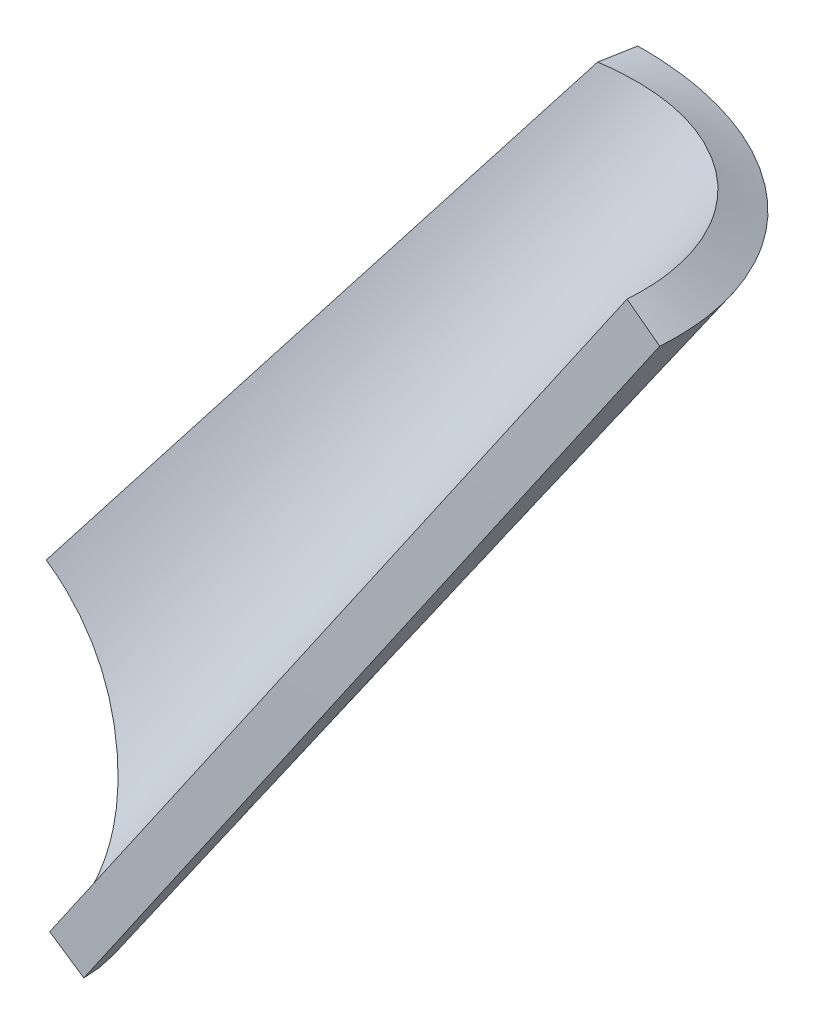
ISO-10303-21;
HEADER;
FILE_DESCRIPTION(('STEP AP214'),'2;1');
FILE_NAME('part.step','',(''),(''),'','','');
FILE_SCHEMA(('AUTOMOTIVE_DESIGN { 1 0 10303 214 1 1 1 1 }'));
ENDSEC;
DATA;
#1=APPLICATION_CONTEXT('core data for automotive mechanical design processes');
#2=APPLICATION_PROTOCOL_DEFINITION('international standard','automotive_design',2000,#1);
#3=PRODUCT_CONTEXT('',#1,'mechanical');
#4=PRODUCT('Part','Part','',(#3));
#5=PRODUCT_RELATED_PRODUCT_CATEGORY('part','',(#4));
#6=PRODUCT_DEFINITION_FORMATION('','',#4);
#7=PRODUCT_DEFINITION_CONTEXT('part definition',#1,'design');
#8=PRODUCT_DEFINITION('design','',#6,#7);
#9=PRODUCT_DEFINITION_SHAPE('','',#8);
#10=(LENGTH_UNIT() NAMED_UNIT(*) SI_UNIT(.MILLI.,.METRE.));
#11=(NAMED_UNIT(*) PLANE_ANGLE_UNIT() SI_UNIT($,.RADIAN.));
#12=(NAMED_UNIT(*) SI_UNIT($,.STERADIAN.) SOLID_ANGLE_UNIT());
#13=UNCERTAINTY_MEASURE_WITH_UNIT(LENGTH_MEASURE(1.E-05),#10,'distance_accuracy_value','');
#14=(GEOMETRIC_REPRESENTATION_CONTEXT(3) GLOBAL_UNCERTAINTY_ASSIGNED_CONTEXT((#13)) GLOBAL_UNIT_ASSIGNED_CONTEXT((#10,
#11,#12)) REPRESENTATION_CONTEXT('',''));
#15=CARTESIAN_POINT('',(0.,0.,0.));
#16=DIRECTION('',(0.,0.,1.));
#17=DIRECTION('',(1.,0.,0.));
#18=AXIS2_PLACEMENT_3D('',#15,#16,#17);
#19=CARTESIAN_POINT('',(19.19780043,40.35560943567,-81.05915159983));
#20=CARTESIAN_POINT('',(15.36714821498,35.196785567,-80.16578797194));
#21=CARTESIAN_POINT('',(11.53463373893,30.03911414575,-79.27382849018));
#22=CARTESIAN_POINT('',(7.700473535317,24.88252279043,-78.38275118747));
#23=CARTESIAN_POINT('',(19.98427932232,40.39850845703,-81.08396009177));
#24=CARTESIAN_POINT('',(16.09145871903,35.08884611076,-80.18347263879));
#25=CARTESIAN_POINT('',(12.19572092038,29.78077982506,-79.28637391232));
#26=CARTESIAN_POINT('',(8.297170356674,24.47442152651,-78.39161751106));
#27=CARTESIAN_POINT('',(21.54532023451,40.47360416492,-80.83326713255));
#28=CARTESIAN_POINT('',(17.53865433005,34.83112028675,-79.93026298569));
#29=CARTESIAN_POINT('',(13.52541873388,29.19050420122,-79.04493479016));
#30=CARTESIAN_POINT('',(9.502772346953,23.55528203759,-78.16746533124));
#31=CARTESIAN_POINT('',(23.55391764842,40.56213321461,-79.567571651));
#32=CARTESIAN_POINT('',(19.36452959766,34.41751848333,-78.71430295676));
#33=CARTESIAN_POINT('',(15.19012914971,28.26270621502,-77.86113210588));
#34=CARTESIAN_POINT('',(11.02204616266,22.1014931435,-77.02473779771));
#35=CARTESIAN_POINT('',(24.91187042956,40.67557922437,-77.60702178161));
#36=CARTESIAN_POINT('',(20.51069286324,34.1947421457,-76.97028198699));
#37=CARTESIAN_POINT('',(16.11295273754,27.71309229054,-76.31726952713));
#38=CARTESIAN_POINT('',(11.7423090518,21.21621165036,-75.63372780884));
#39=CARTESIAN_POINT('',(25.22196463558,40.77395234289,-76.02701783253));
#40=CARTESIAN_POINT('',(20.76364686307,34.19385485233,-75.61910614983));
#41=CARTESIAN_POINT('',(16.30532785949,27.61396059646,-75.20673615172));
#42=CARTESIAN_POINT('',(11.84891001115,21.03374213824,-74.77457848874));
#43=CARTESIAN_POINT('',(25.20849150693,40.82650594131,-75.22750245546));
#44=CARTESIAN_POINT('',(20.75210415669,34.22890895003,-74.93556536451));
#45=CARTESIAN_POINT('',(16.29567679635,27.63141405475,-74.64191497476));
#46=CARTESIAN_POINT('',(11.83951640869,21.03405157658,-74.34104070701));
#47=B_SPLINE_SURFACE_WITH_KNOTS('',3,3,((#19,#20,#21,#22),(#23,#24,#25,#26),(#27,#28,#29,#30),
(#31,#32,#33,#34),(#35,#36,#37,#38),(#39,#40,#41,#42),(#43,#44,#45,#46)),.UNSPECIFIED.,.F.,.F.,
.F.,(4,1,1,1,4),(4,4),(-0.009239570919422,0.2499997679812,0.4999994776936,0.749999187406,
1.009963971349),(-0.009999684538522,1.009999615068),.UNSPECIFIED.);
#48=CARTESIAN_POINT('',(25.0782141319622,40.6264914464682,-75.3104917971679));
#49=CARTESIAN_POINT('',(24.6800187386289,40.0371751706416,-75.2832108346427));
#50=CARTESIAN_POINT('',(24.281823170709,39.4478597825788,-75.2559131057691));
#51=CARTESIAN_POINT('',(22.2908463579273,36.50128707307,-75.1193170582146));
#52=CARTESIAN_POINT('',(20.6980682501908,34.1440425279119,-75.0096965338548));
#53=CARTESIAN_POINT('',(18.3089429496475,30.6081927006993,-74.8442976716293));
#54=CARTESIAN_POINT('',(17.5125748281861,29.4295789261592,-74.7890033717379));
#55=CARTESIAN_POINT('',(15.9253850293488,27.0805354632197,-74.6784017531694));
#56=CARTESIAN_POINT('',(15.1345632127703,25.9101057393345,-74.6230971876131));
#57=CARTESIAN_POINT('',(13.5529454485636,23.5692507758125,-74.5120215838698));
#58=CARTESIAN_POINT('',(12.7621495009379,22.3988255361761,-74.4562505456344));
#59=CARTESIAN_POINT('',(11.9713695786178,21.2284023716688,-74.400209344384));
#60=B_SPLINE_CURVE_WITH_KNOTS('',3,(#48,#49,#50,#51,#52,#53,#54,#55,#56,#57,#58,#59),
.UNSPECIFIED.,.F.,.F.,(4,2,2,2,2,4),(0.,2.13526989135754,10.6763495580857,14.9468893713277,
19.1877938378051,23.4286987430444),.UNSPECIFIED.);
#61=CARTESIAN_POINT('',(25.0782141423339,40.626491461818,-75.3104917978784));
#62=VERTEX_POINT('',#61);
#63=CARTESIAN_POINT('',(11.9713695846468,21.2284023806685,-74.4002091368315));
#64=VERTEX_POINT('',#63);
#65=EDGE_CURVE('E60',#62,#64,#60,.T.);
#66=CARTESIAN_POINT('',(18.7381080046836,39.6273094041304,-80.9346082763461));
#67=CARTESIAN_POINT('',(18.9223542234289,39.6474171703624,-80.9401558983225));
#68=CARTESIAN_POINT('',(19.106810597893,39.667686404681,-80.9383074153619));
#69=CARTESIAN_POINT('',(19.4750291798496,39.7085708415526,-80.919808656822));
#70=CARTESIAN_POINT('',(19.6587910159293,39.729186203892,-80.9031513496952));
#71=CARTESIAN_POINT('',(20.0248102287611,39.7708216241755,-80.8549566711681));
#72=CARTESIAN_POINT('',(20.2070623662183,39.7918426052531,-80.82338021157));
#73=CARTESIAN_POINT('',(20.5682783872567,39.8342965937615,-80.745297275747));
#74=CARTESIAN_POINT('',(20.7472427339062,39.8557295422852,-80.6987929193491));
#75=CARTESIAN_POINT('',(21.1009750340508,39.8985608769585,-80.5903233025079));
#76=CARTESIAN_POINT('',(21.2757305934614,39.9199590205191,-80.5283173473774));
#77=CARTESIAN_POINT('',(21.6190892490573,39.9621734699416,-80.3889581400054));
#78=CARTESIAN_POINT('',(21.7876924667987,39.9829897872971,-80.3116051911796));
#79=CARTESIAN_POINT('',(22.1171202374812,40.0242819805682,-80.1422526949256));
#80=CARTESIAN_POINT('',(22.2779548231166,40.0447582718777,-80.050272734545));
#81=CARTESIAN_POINT('',(22.5908463611605,40.0863554012508,-79.8524555724455));
#82=CARTESIAN_POINT('',(22.7429017076231,40.1074763561663,-79.746615846923));
#83=CARTESIAN_POINT('',(22.9837615678866,40.1427679439171,-79.5622557227502));
#84=CARTESIAN_POINT('',(23.075611591035,40.1567001284279,-79.4876366619093));
#85=CARTESIAN_POINT('',(23.2546416572791,40.1847404985631,-79.3330390329096));
#86=CARTESIAN_POINT('',(23.3418226571169,40.198848647394,-79.2530615703746));
#87=CARTESIAN_POINT('',(23.5110140195986,40.226721253499,-79.0877911552924));
#88=CARTESIAN_POINT('',(23.5930256875527,40.2404857970027,-79.0024995555245));
#89=CARTESIAN_POINT('',(23.7513904903141,40.2672326180138,-78.8266487585991));
#90=CARTESIAN_POINT('',(23.8277420722414,40.2802146806614,-78.7360881279243));
#91=CARTESIAN_POINT('',(23.9743304597319,40.3052932180398,-78.5500015860235));
#92=CARTESIAN_POINT('',(24.0445661800552,40.3173895355376,-78.4544747983523));
#93=CARTESIAN_POINT('',(24.1786486297008,40.3409844332299,-78.2589829894365));
#94=CARTESIAN_POINT('',(24.2424954570985,40.3524830225987,-78.1590180363559));
#95=CARTESIAN_POINT('',(24.3842013345038,40.3793450893748,-77.920943375623));
#96=CARTESIAN_POINT('',(24.4595376426039,40.3947059752211,-77.7813256028293));
#97=CARTESIAN_POINT('',(24.5983525019161,40.4260643145763,-77.4963565302871));
#98=CARTESIAN_POINT('',(24.661830111188,40.4420618185297,-77.3510047761964));
#99=CARTESIAN_POINT('',(24.7476627432603,40.4661834717212,-77.1294989085915));
#100=CARTESIAN_POINT('',(24.7746984140783,40.4742408382741,-77.0551221952413));
#101=CARTESIAN_POINT('',(24.8255500513493,40.4902536627897,-76.9052574408032));
#102=CARTESIAN_POINT('',(24.8493659996662,40.4982091201781,-76.8297693934582));
#103=CARTESIAN_POINT('',(24.8935625121015,40.513760413001,-76.677801885137));
#104=CARTESIAN_POINT('',(24.9139449581568,40.5213564437881,-76.6013229921727));
#105=CARTESIAN_POINT('',(24.9511683001084,40.5360763942494,-76.4474707360835));
#106=CARTESIAN_POINT('',(24.9680095477754,40.5432003607688,-76.3700974626098));
#107=CARTESIAN_POINT('',(24.9987096348412,40.5572608539199,-76.2115478668985));
#108=CARTESIAN_POINT('',(25.0124244821511,40.5641788770908,-76.1303419979385));
#109=CARTESIAN_POINT('',(25.035967663063,40.5775575060188,-75.9673403839675));
#110=CARTESIAN_POINT('',(25.0457963867318,40.5840181576309,-75.8855446989985));
#111=CARTESIAN_POINT('',(25.0615834321387,40.59657485729,-75.7216490058982));
#112=CARTESIAN_POINT('',(25.0675461335231,40.6026713107849,-75.6395494484687));
#113=CARTESIAN_POINT('',(25.075695037663,40.6146785336032,-75.4751318461972));
#114=CARTESIAN_POINT('',(25.0778804637681,40.6205892644948,-75.3928137599071));
#115=CARTESIAN_POINT('',(25.0782141400809,40.6264914228395,-75.3104923404911));
#116=B_SPLINE_CURVE_WITH_KNOTS('',3,(#66,#67,#68,#69,#70,#71,#72,#73,#74,#75,#76,#77,#78,#79,
#80,#81,#82,#83,#84,#85,#86,#87,#88,#89,#90,#91,#92,#93,#94,#95,#96,#97,#98,#99,#100,#101,#102,
#103,#104,#105,#106,#107,#108,#109,#110,#111,#112,#113,#114,#115),.UNSPECIFIED.,.F.,.F.,(4,2,2,
2,2,2,2,2,2,2,2,2,2,2,2,2,2,2,2,2,2,2,2,2,4),(0.,0.556131107097961,1.1125264182948,
1.67038763869626,2.22816967536955,2.78743166269778,3.34668259431151,3.90519084271224,
4.46380093485633,4.82108913601933,5.17830384194444,5.53542798306691,5.89264974357406,
6.24993476330356,6.60721429753747,7.08482116919518,7.56246596120202,7.80104847976377,
8.03963234215928,8.27808500582435,8.51651397120761,8.76435592725861,9.01217300003602,
9.25970883895971,9.50729556799756),.UNSPECIFIED.);
#117=CARTESIAN_POINT('',(18.738123586735,39.6271726135356,-80.9345860406653));
#118=VERTEX_POINT('',#117);
#119=EDGE_CURVE('E68',#118,#62,#116,.T.);
#120=CARTESIAN_POINT('',(18.7382894792975,39.6270526252046,-80.9345685017668));
#121=CARTESIAN_POINT('',(18.3182473785016,39.0606168881886,-80.8367184609739));
#122=CARTESIAN_POINT('',(17.8981815966424,38.4941953862846,-80.7388876681943));
#123=CARTESIAN_POINT('',(15.7977355888738,35.6621587186584,-80.2498260540936));
#124=CARTESIAN_POINT('',(14.1170041442743,33.3967561820912,-79.8588723000408));
#125=CARTESIAN_POINT('',(10.9166658296751,29.0844676346334,-79.1150701832488));
#126=CARTESIAN_POINT('',(9.39712449428158,27.0375407583459,-78.7621767683693));
#127=CARTESIAN_POINT('',(7.87730370356891,24.9907931651012,-78.4094474228258));
#128=B_SPLINE_CURVE_WITH_KNOTS('',3,(#120,#121,#122,#123,#124,#125,#126,#127),.UNSPECIFIED.,.F.,
.F.,(4,2,2,4),(0.,2.13582184978764,10.6791093789882,18.3999280576752),.UNSPECIFIED.);
#129=CARTESIAN_POINT('',(7.87707592739809,24.9909331640915,-78.4096164939905));
#130=VERTEX_POINT('',#129);
#131=EDGE_CURVE('E129',#118,#130,#128,.T.);
#132=CARTESIAN_POINT('',(11.9713695906757,21.2284023896681,-74.4002089292789));
#133=CARTESIAN_POINT('',(11.9721113244206,21.2294054281782,-74.4707531005988));
#134=CARTESIAN_POINT('',(11.9710751650357,21.2328776734502,-74.5412767034068));
#135=CARTESIAN_POINT('',(11.96540254008,21.2445990031911,-74.6817173031448));
#136=CARTESIAN_POINT('',(11.9607692860076,21.2528438250179,-74.7516347849476));
#137=CARTESIAN_POINT('',(11.9479175018375,21.2738561533096,-74.8898010721066));
#138=CARTESIAN_POINT('',(11.939731596329,21.2865823109407,-74.9580592301995));
#139=CARTESIAN_POINT('',(11.9198994068338,21.316224559136,-75.0931517821999));
#140=CARTESIAN_POINT('',(11.9082523144492,21.3331416283797,-75.1599858395804));
#141=CARTESIAN_POINT('',(11.877377478121,21.3768143975801,-75.3132890094175));
#142=CARTESIAN_POINT('',(11.8569162780876,21.4049822296438,-75.3991102919041));
#143=CARTESIAN_POINT('',(11.8108604391054,21.4667584239535,-75.5673273750255));
#144=CARTESIAN_POINT('',(11.7852635322466,21.50036918851,-75.6497216428273));
#145=CARTESIAN_POINT('',(11.701434875546,21.6080529972218,-75.8922169640233));
#146=CARTESIAN_POINT('',(11.6362880172432,21.6888005991664,-76.0470558298476));
#147=CARTESIAN_POINT('',(11.5125853844373,21.8358014919121,-76.2960013459032));
#148=CARTESIAN_POINT('',(11.4581497931849,21.8988903540777,-76.3941556565606));
#149=CARTESIAN_POINT('',(11.3423041805419,22.0297028550939,-76.583039793868));
#150=CARTESIAN_POINT('',(11.2808925594439,22.0974275555905,-76.6737679093409));
#151=CARTESIAN_POINT('',(11.1517168801826,22.2364885038001,-76.8478085111692));
#152=CARTESIAN_POINT('',(11.0839453742121,22.3078289396569,-76.931112074727));
#153=CARTESIAN_POINT('',(10.9427795620367,22.4531454332105,-77.0903145828997));
#154=CARTESIAN_POINT('',(10.8693842425356,22.5271219645871,-77.1662121874851));
#155=CARTESIAN_POINT('',(10.684760360887,22.7097362397768,-77.3432213231785));
#156=CARTESIAN_POINT('',(10.5710693005538,22.8193317445461,-77.4407724080506));
#157=CARTESIAN_POINT('',(10.3357524180354,23.0407906908017,-77.6229954520362));
#158=CARTESIAN_POINT('',(10.2141230649257,23.152655126042,-77.7076616234284));
#159=CARTESIAN_POINT('',(10.0261983704079,23.3211753188948,-77.8247384448486));
#160=CARTESIAN_POINT('',(9.96263552523736,23.377476003179,-77.8621141433362));
#161=CARTESIAN_POINT('',(9.83370728415754,23.4901977864759,-77.9334327897149));
#162=CARTESIAN_POINT('',(9.76834190313128,23.5466188844908,-77.9673757659382));
#163=CARTESIAN_POINT('',(9.63589315455643,23.6594594338743,-78.0316010029658));
#164=CARTESIAN_POINT('',(9.56881061044956,23.7158788735087,-78.0618849799667));
#165=CARTESIAN_POINT('',(9.43297926277047,23.8286022839347,-78.1186747921955));
#166=CARTESIAN_POINT('',(9.36423051679601,23.8849062586449,-78.1451807578054));
#167=CARTESIAN_POINT('',(9.18297838383993,24.0312728818292,-78.2093736043477));
#168=CARTESIAN_POINT('',(9.06922186840676,24.1211032213965,-78.2440941471988));
#169=CARTESIAN_POINT('',(8.8383094422847,24.2996163926825,-78.3038077841172));
#170=CARTESIAN_POINT('',(8.72115325201076,24.3882991291516,-78.3288000756952));
#171=CARTESIAN_POINT('',(8.48417539214814,24.5639566500661,-78.3689423428071));
#172=CARTESIAN_POINT('',(8.36435793865981,24.650933775019,-78.3841068774712));
#173=CARTESIAN_POINT('',(8.12237545365414,24.8227167278798,-78.4043825098799));
#174=CARTESIAN_POINT('',(8.00021083999007,24.9075229361089,-78.4094953806299));
#175=CARTESIAN_POINT('',(7.87709415525928,24.9909599163604,-78.4094501336042));
#176=B_SPLINE_CURVE_WITH_KNOTS('',3,(#132,#133,#134,#135,#136,#137,#138,#139,#140,#141,#142,
#143,#144,#145,#146,#147,#148,#149,#150,#151,#152,#153,#154,#155,#156,#157,#158,#159,#160,#161,
#162,#163,#164,#165,#166,#167,#168,#169,#170,#171,#172,#173,#174,#175),.UNSPECIFIED.,.F.,.F.,(4,
2,2,2,2,2,2,2,2,2,2,2,2,2,2,2,2,2,2,2,2,4),(0.,0.211595329538772,0.423001962987934,
0.63250698486485,0.842060977438049,1.11945390846524,1.39696960591068,1.95382119957205,
2.33965903427583,2.72558552662861,3.11196974012975,3.49842373661253,4.05455247129688,
4.61093027848955,4.88918496087899,5.16743734648346,5.44555871127829,5.72367047556495,
6.17042451790721,6.61721540545856,7.06334288151805,7.50939165842329),.UNSPECIFIED.);
#177=EDGE_CURVE('E77',#64,#130,#176,.T.);
#178=ORIENTED_EDGE('',*,*,#65,.F.);
#179=ORIENTED_EDGE('',*,*,#119,.F.);
#180=ORIENTED_EDGE('',*,*,#131,.T.);
#181=ORIENTED_EDGE('',*,*,#177,.F.);
#182=EDGE_LOOP('',(#178,#179,#180,#181));
#183=FACE_BOUND('',#182,.T.);
#184=ADVANCED_FACE('F16',(#183),#47,.F.);
#185=CARTESIAN_POINT('',(25.94092029263,40.04781234963,-75.24660664052));
#186=CARTESIAN_POINT('',(25.64248314414,40.24900997379,-75.2604920733));
#187=CARTESIAN_POINT('',(25.34404599564,40.45020759795,-75.27437750608));
#188=CARTESIAN_POINT('',(25.04560884714,40.65140522211,-75.28826293886));
#189=CARTESIAN_POINT('',(25.94035007971,40.0480048837,-75.25334606068));
#190=CARTESIAN_POINT('',(25.6419757189,40.24906417069,-75.26710891896));
#191=CARTESIAN_POINT('',(25.34360135809,40.45012345768,-75.28087177725));
#192=CARTESIAN_POINT('',(25.04522699728,40.65118274468,-75.29463463553));
#193=CARTESIAN_POINT('',(25.94048365738,40.04628754776,-75.26320621873));
#194=CARTESIAN_POINT('',(25.64202190371,40.24732082345,-75.27683516428));
#195=CARTESIAN_POINT('',(25.34356015005,40.44835409916,-75.29046410973));
#196=CARTESIAN_POINT('',(25.04509839639,40.64938737484,-75.30409305526));
#197=CARTESIAN_POINT('',(25.93900380611,40.01064065103,-75.77263919003));
#198=CARTESIAN_POINT('',(25.64042168016,40.21305135032,-75.76256713581));
#199=CARTESIAN_POINT('',(25.34183955354,40.41546204894,-75.75249508694));
#200=CARTESIAN_POINT('',(25.04325742759,40.61787274889,-75.74242303406));
#201=CARTESIAN_POINT('',(25.83438065699,39.93455930169,-76.82292733352));
#202=CARTESIAN_POINT('',(25.53913305679,40.13838738605,-76.76482916549));
#203=CARTESIAN_POINT('',(25.24388545691,40.34221547072,-76.70673099497));
#204=CARTESIAN_POINT('',(24.94863785671,40.54604355477,-76.64863282632));
#205=CARTESIAN_POINT('',(25.0706132398,39.78111780156,-78.62433790298));
#206=CARTESIAN_POINT('',(24.80208726483,39.97883682262,-78.47974697417));
#207=CARTESIAN_POINT('',(24.53356128978,40.1765558436,-78.33515604603));
#208=CARTESIAN_POINT('',(24.26503531482,40.37427486474,-78.19056511739));
#209=CARTESIAN_POINT('',(24.05839777559,39.66702155703,-79.91005506095));
#210=CARTESIAN_POINT('',(23.82833181227,39.85210771572,-79.69805651729));
#211=CARTESIAN_POINT('',(23.59826584897,40.03719387442,-79.48605797346));
#212=CARTESIAN_POINT('',(23.36819988564,40.22228003308,-79.27405942975));
#213=CARTESIAN_POINT('',(22.46655221821,39.5435614939,-81.11149349779));
#214=CARTESIAN_POINT('',(22.30013084167,39.70251140315,-80.82812526281));
#215=CARTESIAN_POINT('',(22.13370946512,39.8614613124,-80.54475702788));
#216=CARTESIAN_POINT('',(21.96728808858,40.02041122165,-80.26138879292));
#217=CARTESIAN_POINT('',(20.77635418608,39.47659105738,-81.78213649375));
#218=CARTESIAN_POINT('',(20.68416364969,39.59742075109,-81.45051898921));
#219=CARTESIAN_POINT('',(20.5919731133,39.7182504448,-81.11890148466));
#220=CARTESIAN_POINT('',(20.49978257692,39.83908013851,-80.78728398012));
#221=CARTESIAN_POINT('',(19.38475559539,39.45671957254,-81.97433023186));
#222=CARTESIAN_POINT('',(19.35729632339,39.53712792575,-81.6218385388));
#223=CARTESIAN_POINT('',(19.32983705138,39.61753627896,-81.26934684574));
#224=CARTESIAN_POINT('',(19.30237777938,39.69794463217,-80.91685515269));
#225=CARTESIAN_POINT('',(18.65289868057,39.45962573773,-81.96008527879));
#226=CARTESIAN_POINT('',(18.66078929169,39.51531661565,-81.60438903214));
#227=CARTESIAN_POINT('',(18.66867990281,39.57100749356,-81.24869278548));
#228=CARTESIAN_POINT('',(18.67657051393,39.62669837147,-80.89299653882));
#229=CARTESIAN_POINT('',(18.61633890093,39.45980416526,-81.95908821844));
#230=CARTESIAN_POINT('',(18.62599865794,39.51425167129,-81.60325128919));
#231=CARTESIAN_POINT('',(18.63565841494,39.56869917731,-81.24741435994));
#232=CARTESIAN_POINT('',(18.64531817195,39.62314668333,-80.89157743069));
#233=B_SPLINE_SURFACE_WITH_KNOTS('',3,3,((#185,#186,#187,#188),(#189,#190,#191,#192),(#193,#194,
#195,#196),(#197,#198,#199,#200),(#201,#202,#203,#204),(#205,#206,#207,#208),(#209,#210,#211,
#212),(#213,#214,#215,#216),(#217,#218,#219,#220),(#221,#222,#223,#224),(#225,#226,#227,#228),
(#229,#230,#231,#232)),.UNSPECIFIED.,.F.,.F.,.F.,(4,1,1,1,1,1,1,1,1,4),(4,4),
(-0.003045846053759,0.,5.89659742126E-07,0.1666671580497,0.3333337264395,0.5000002948295,
0.6666668632194,0.8333334316092,1.,1.008753606322),(0.2268548810522,0.7723349591672),.UNSPECIFIED.);
#234=DIRECTION('',(-0.82881270956616,0.558323841495139,-0.0366603393289187));
#235=VECTOR('',#234,1.);
#236=CARTESIAN_POINT('',(25.4926204882784,40.3473295279777,-75.2921616276032));
#237=LINE('',#236,#235);
#238=CARTESIAN_POINT('',(25.9070367141086,40.0681609312454,-75.2738310199538));
#239=VERTEX_POINT('',#238);
#240=EDGE_CURVE('E70',#239,#62,#237,.T.);
#241=CARTESIAN_POINT('',(18.7263829643807,39.4658813084176,-81.9214232581428));
#242=CARTESIAN_POINT('',(18.9116532030854,39.4660259626253,-81.9237212367381));
#243=CARTESIAN_POINT('',(19.0970057677542,39.4668925114502,-81.9191365544731));
#244=CARTESIAN_POINT('',(19.4668396602265,39.4700840424197,-81.8962941636007));
#245=CARTESIAN_POINT('',(19.6513210547807,39.4724089109366,-81.8780375202498));
#246=CARTESIAN_POINT('',(20.0183463712687,39.4785307503333,-81.8279519561687));
#247=CARTESIAN_POINT('',(20.2008909022246,39.4823272434835,-81.796127439608));
#248=CARTESIAN_POINT('',(20.5631088934072,39.4914811598339,-81.7191225893236));
#249=CARTESIAN_POINT('',(20.7427822173759,39.4968386568836,-81.6739416237187));
#250=CARTESIAN_POINT('',(21.0983914304061,39.5089595497439,-81.5703831466504));
#251=CARTESIAN_POINT('',(21.2743243513518,39.5157240192656,-81.5119955537437));
#252=CARTESIAN_POINT('',(21.6212013949667,39.5302400486662,-81.3820406579841));
#253=CARTESIAN_POINT('',(21.7921459350094,39.5379915256704,-81.3104744614568));
#254=CARTESIAN_POINT('',(22.1280653245422,39.5542585105135,-81.1543669326253));
#255=CARTESIAN_POINT('',(22.2930375268656,39.5627743514672,-81.0698199316847));
#256=CARTESIAN_POINT('',(22.6158907779645,39.5808420125558,-80.8882018930492));
#257=CARTESIAN_POINT('',(22.7737710087159,39.590393951768,-80.7911294155774));
#258=CARTESIAN_POINT('',(23.0970498142727,39.6121169672108,-80.5748181506543));
#259=CARTESIAN_POINT('',(23.2616072013637,39.6244548517486,-80.4543318703757));
#260=CARTESIAN_POINT('',(23.5002480519375,39.64440907196,-80.2635608589635));
#261=CARTESIAN_POINT('',(23.5784437051387,39.6513032094959,-80.1982830945969));
#262=CARTESIAN_POINT('',(23.7319238653716,39.6655108292483,-80.0644403975985));
#263=CARTESIAN_POINT('',(23.8072083964704,39.6728243079968,-79.9958754921528));
#264=CARTESIAN_POINT('',(24.028386284204,39.6951594052941,-79.7853026398325));
#265=CARTESIAN_POINT('',(24.1696537975541,39.7105799990779,-79.6383768459908));
#266=CARTESIAN_POINT('',(24.3706828481791,39.7332212776566,-79.4085791507266));
#267=CARTESIAN_POINT('',(24.4358786356494,39.7406865438271,-79.3304143301006));
#268=CARTESIAN_POINT('',(24.562460680278,39.755383652462,-79.1710376669669));
#269=CARTESIAN_POINT('',(24.6238472743775,39.762615515545,-79.0898260949813));
#270=CARTESIAN_POINT('',(24.7581320075451,39.7787296682513,-78.9029708037482));
#271=CARTESIAN_POINT('',(24.8298584264933,39.7875506447368,-78.7964777135087));
#272=CARTESIAN_POINT('',(24.9668697983796,39.8051870064471,-78.5793983260272));
#273=CARTESIAN_POINT('',(25.0321532010907,39.8140023898217,-78.4688110524598));
#274=CARTESIAN_POINT('',(25.1562700135229,39.8320770297936,-78.2440727088514));
#275=CARTESIAN_POINT('',(25.215101654217,39.8413364071357,-78.129920672346));
#276=CARTESIAN_POINT('',(25.3261359145126,39.8604785447283,-77.8985507500618));
#277=CARTESIAN_POINT('',(25.3783415053749,39.8703610225704,-77.7813342670862));
#278=CARTESIAN_POINT('',(25.4759529340162,39.8906994223335,-77.5441876622842));
#279=CARTESIAN_POINT('',(25.5213604366455,39.9011552029928,-77.4242582131715));
#280=CARTESIAN_POINT('',(25.6051162058552,39.9223529122747,-77.1820212933084));
#281=CARTESIAN_POINT('',(25.6434671673957,39.9330947298553,-77.0597147502059));
#282=CARTESIAN_POINT('',(25.6969575809087,39.9494481426737,-76.8688131624032));
#283=CARTESIAN_POINT('',(25.7147464000344,39.9551812133369,-76.8009628477768));
#284=CARTESIAN_POINT('',(25.7479872790006,39.966464189321,-76.6646767188933));
#285=CARTESIAN_POINT('',(25.7634393103628,39.9720140924089,-76.5962408975114));
#286=CARTESIAN_POINT('',(25.806251865832,39.9883847337586,-76.390195094952));
#287=CARTESIAN_POINT('',(25.8300784672093,39.9989293546256,-76.2518125091472));
#288=CARTESIAN_POINT('',(25.8681846342607,40.0193522156074,-75.973828979402));
#289=CARTESIAN_POINT('',(25.8824732259451,40.0292310777593,-75.8342293143366));
#290=CARTESIAN_POINT('',(25.8968862782672,40.0438532768555,-75.6243430949701));
#291=CARTESIAN_POINT('',(25.9005206775644,40.0486954793153,-75.5542877735994));
#292=CARTESIAN_POINT('',(25.9054912221307,40.0583957622604,-75.4140995262092));
#293=CARTESIAN_POINT('',(25.9068274663096,40.0632538420533,-75.3439666036595));
#294=CARTESIAN_POINT('',(25.9070367165502,40.068160988158,-75.2738302068942));
#295=B_SPLINE_CURVE_WITH_KNOTS('',3,(#241,#242,#243,#244,#245,#246,#247,#248,#249,#250,#251,
#252,#253,#254,#255,#256,#257,#258,#259,#260,#261,#262,#263,#264,#265,#266,#267,#268,#269,#270,
#271,#272,#273,#274,#275,#276,#277,#278,#279,#280,#281,#282,#283,#284,#285,#286,#287,#288,#289,
#290,#291,#292,#293,#294),.UNSPECIFIED.,.F.,.F.,(4,2,2,2,2,2,2,2,2,2,2,2,2,2,2,2,2,2,2,2,2,2,2,
2,2,2,4),(0.,0.555722171937321,1.11140104905389,1.66689968842998,2.22242461213818,
2.7783750425207,3.3342788228819,3.89042605708105,4.44663727626723,5.05879711230118,
5.36499751524015,5.67119538618616,6.2834000743917,6.58948337089567,6.89553955416746,
7.28139460837675,7.66734227635498,8.05339550521101,8.43927500337594,8.82505984461004,
9.21069704374702,9.42179176715101,9.63288906295478,10.0549767494037,10.4766644373845,
10.6875810685918,10.8984886219687),.UNSPECIFIED.);
#296=CARTESIAN_POINT('',(18.7263829643787,39.4658813084143,-81.9214232581628));
#297=VERTEX_POINT('',#296);
#298=EDGE_CURVE('E169',#297,#239,#295,.T.);
#299=CARTESIAN_POINT('',(18.7263829643768,39.465881308411,-81.9214232581828));
#300=CARTESIAN_POINT('',(18.7274624117652,39.4802511345817,-81.8336051413388));
#301=CARTESIAN_POINT('',(18.7285418591536,39.4946209607518,-81.7457870244947));
#302=CARTESIAN_POINT('',(18.7307007539305,39.5233606130909,-81.5701507908063));
#303=CARTESIAN_POINT('',(18.7317802013191,39.53773043926,-81.482332673962));
#304=CARTESIAN_POINT('',(18.7347439657461,39.5771846822906,-81.2412165126564));
#305=CARTESIAN_POINT('',(18.7366282827853,39.6022690991514,-81.087918468195));
#306=CARTESIAN_POINT('',(18.7385125998266,39.6273535160124,-80.9346204237336));
#307=B_SPLINE_CURVE_WITH_KNOTS('',3,(#299,#300,#301,#302,#303,#304,#305,#306),.UNSPECIFIED.,.F.,
.F.,(4,2,2,4),(0.,0.266977730928705,0.533955461857393,1.00000011798037),.UNSPECIFIED.);
#308=EDGE_CURVE('E73',#297,#118,#307,.T.);
#309=ORIENTED_EDGE('',*,*,#240,.F.);
#310=ORIENTED_EDGE('',*,*,#298,.F.);
#311=ORIENTED_EDGE('',*,*,#308,.T.);
#312=ORIENTED_EDGE('',*,*,#119,.T.);
#313=EDGE_LOOP('',(#309,#310,#311,#312));
#314=FACE_BOUND('',#313,.T.);
#315=ADVANCED_FACE('F69',(#314),#233,.T.);
#316=CARTESIAN_POINT('',(12.69685419622,20.45569737336,-74.39127402158));
#317=CARTESIAN_POINT('',(12.40202454884,20.65490022426,-74.39115180866));
#318=CARTESIAN_POINT('',(12.10719490146,20.85410307516,-74.39102959573));
#319=CARTESIAN_POINT('',(11.81236525409,21.05330592606,-74.3909073828));
#320=CARTESIAN_POINT('',(12.74054433883,20.5203626539,-74.39418054591));
#321=CARTESIAN_POINT('',(12.44571330591,20.71956347814,-74.39412411034));
#322=CARTESIAN_POINT('',(12.15088227299,20.91876430239,-74.39406767478));
#323=CARTESIAN_POINT('',(11.85605124007,21.11796512663,-74.39401123921));
#324=CARTESIAN_POINT('',(17.15326359805,27.0515782041,-74.68774333232));
#325=CARTESIAN_POINT('',(16.85829436266,27.25057450533,-74.6943005749));
#326=CARTESIAN_POINT('',(16.56332512727,27.44957080657,-74.70085781748));
#327=CARTESIAN_POINT('',(16.26835589188,27.6485671078,-74.70741506005));
#328=CARTESIAN_POINT('',(21.60965659871,33.64745770984,-74.98449919649));
#329=CARTESIAN_POINT('',(21.31472324272,33.84626504332,-74.99471290794));
#330=CARTESIAN_POINT('',(21.01978988673,34.04507237679,-75.00492661939));
#331=CARTESIAN_POINT('',(20.72485653074,34.24387971026,-75.01514033084));
#332=CARTESIAN_POINT('',(26.02236037352,40.17866831264,-75.27841514681));
#333=CARTESIAN_POINT('',(25.7274546105,40.37732692161,-75.29151680691));
#334=CARTESIAN_POINT('',(25.43254884748,40.57598553059,-75.30461846702));
#335=CARTESIAN_POINT('',(25.13764308446,40.77464413956,-75.31772012712));
#336=CARTESIAN_POINT('',(26.06605058976,40.24333388185,-75.28132521763));
#337=CARTESIAN_POINT('',(25.77114509898,40.44199102208,-75.29445540173));
#338=CARTESIAN_POINT('',(25.4762396082,40.64064816232,-75.30758558583));
#339=CARTESIAN_POINT('',(25.18133411742,40.83930530256,-75.32071576993));
#340=B_SPLINE_SURFACE_WITH_KNOTS('',3,3,((#316,#317,#318,#319),(#320,#321,#322,#323),(#324,#325,
#326,#327),(#328,#329,#330,#331),(#332,#333,#334,#335),(#336,#337,#338,#339)),.UNSPECIFIED.,.F.,
.F.,.F.,(4,1,1,4),(4,4),(0.0004356178071366,0.01013163510094,0.9797366978576,0.9894327663633),
(0.2303387173938,0.7696612826046),.UNSPECIFIED.);
#341=DIRECTION('',(-0.828608816844659,0.559827996949606,-0.000206103582804112));
#342=VECTOR('',#341,1.);
#343=CARTESIAN_POINT('',(12.3856630311756,20.9484957560821,-74.4001037693544));
#344=LINE('',#343,#342);
#345=CARTESIAN_POINT('',(12.7999785094732,20.668574278452,-74.4000022746559));
#346=VERTEX_POINT('',#345);
#347=EDGE_CURVE('E79',#346,#64,#344,.T.);
#348=CARTESIAN_POINT('',(25.9070367267634,40.0681609499757,-75.2738310207975));
#349=CARTESIAN_POINT('',(25.5088478339404,39.4788067458336,-75.2472843006888));
#350=CARTESIAN_POINT('',(25.1106589414729,38.8894525414761,-75.2207375800299));
#351=CARTESIAN_POINT('',(23.1197144812014,35.9426815184289,-75.0880039737155));
#352=CARTESIAN_POINT('',(21.5269589195947,33.5852646959602,-74.9818170790005));
#353=CARTESIAN_POINT('',(19.1378255926253,30.0491394527099,-74.822536717276));
#354=CARTESIAN_POINT('',(18.3414478195423,28.870431036702,-74.7694432600925));
#355=CARTESIAN_POINT('',(16.7542214722433,26.5211978864028,-74.6636249612536));
#356=CARTESIAN_POINT('',(15.9633728979817,25.3506731521398,-74.6109001196569));
#357=CARTESIAN_POINT('',(14.3816757581366,23.0096236782309,-74.5054504257973));
#358=CARTESIAN_POINT('',(13.5908271925533,21.8390989385849,-74.4527255735344));
#359=CARTESIAN_POINT('',(12.7999786323857,20.6685741955723,-74.4000007147803));
#360=B_SPLINE_CURVE_WITH_KNOTS('',3,(#348,#349,#350,#351,#352,#353,#354,#355,#356,#357,#358,
#359),.UNSPECIFIED.,.F.,.F.,(4,2,2,2,2,4),(0.,2.13526989064721,10.6763494532361,
14.9468892345306,19.1877789723912,23.4286687102518),.UNSPECIFIED.);
#361=EDGE_CURVE('E83',#239,#346,#360,.T.);
#362=ORIENTED_EDGE('',*,*,#347,.F.);
#363=ORIENTED_EDGE('',*,*,#361,.F.);
#364=ORIENTED_EDGE('',*,*,#240,.T.);
#365=ORIENTED_EDGE('',*,*,#65,.T.);
#366=EDGE_LOOP('',(#362,#363,#364,#365));
#367=FACE_BOUND('',#366,.T.);
#368=ADVANCED_FACE('F81',(#367),#340,.T.);
#369=CARTESIAN_POINT('',(7.727983506462,24.92078091973,-79.43299573654));
#370=CARTESIAN_POINT('',(7.758606970619,24.95891471799,-79.08049898439));
#371=CARTESIAN_POINT('',(7.789230434776,24.99704851625,-78.72800223224));
#372=CARTESIAN_POINT('',(7.819853898933,25.03518231451,-78.3755054801));
#373=CARTESIAN_POINT('',(7.751147835669,24.90510468179,-79.43330494416));
#374=CARTESIAN_POINT('',(7.780724751225,24.94397774961,-79.08080123209));
#375=CARTESIAN_POINT('',(7.81030166678,24.98285081743,-78.72829752003));
#376=CARTESIAN_POINT('',(7.839878582335,25.02172388525,-78.37579380796));
#377=CARTESIAN_POINT('',(8.050129783479,24.70222466843,-79.43534390345));
#378=CARTESIAN_POINT('',(8.066320195943,24.75050328149,-79.0828057043));
#379=CARTESIAN_POINT('',(8.082510608406,24.79878189455,-78.73026750515));
#380=CARTESIAN_POINT('',(8.09870102087,24.84706050761,-78.37772930599));
#381=CARTESIAN_POINT('',(8.615819272172,24.30467537574,-79.39031631451));
#382=CARTESIAN_POINT('',(8.60926314522,24.36772330929,-79.03919076925));
#383=CARTESIAN_POINT('',(8.602707018269,24.43077124284,-78.68806522399));
#384=CARTESIAN_POINT('',(8.596150891317,24.49381917638,-78.33693967874));
#385=CARTESIAN_POINT('',(9.43007768968,23.69342846523,-79.18558454322));
#386=CARTESIAN_POINT('',(9.383806801252,23.78117890979,-78.84361327944));
#387=CARTESIAN_POINT('',(9.337535912823,23.86892935436,-78.50164201565));
#388=CARTESIAN_POINT('',(9.291265024395,23.95667979892,-78.15967075187));
#389=CARTESIAN_POINT('',(10.18977663636,23.08501881201,-78.85401921655));
#390=CARTESIAN_POINT('',(10.10279892123,23.19579903508,-78.52495858869));
#391=CARTESIAN_POINT('',(10.01582120611,23.30657925815,-78.19589796083));
#392=CARTESIAN_POINT('',(9.928843490991,23.41735948122,-77.86683733297));
#393=CARTESIAN_POINT('',(10.86680942703,22.50992766425,-78.41591913678));
#394=CARTESIAN_POINT('',(10.74236107485,22.6396952988,-78.10496132078));
#395=CARTESIAN_POINT('',(10.61791272268,22.76946293335,-77.79400350478));
#396=CARTESIAN_POINT('',(10.4934643705,22.8992305679,-77.48304568878));
#397=CARTESIAN_POINT('',(11.44565342844,21.99177945225,-77.89431783199));
#398=CARTESIAN_POINT('',(11.28595120487,22.13878064643,-77.61088394583));
#399=CARTESIAN_POINT('',(11.1262489813,22.28578184061,-77.32745005968));
#400=CARTESIAN_POINT('',(10.96654675773,22.4327830348,-77.04401617352));
#401=CARTESIAN_POINT('',(11.91111323737,21.55662046715,-77.32720715379));
#402=CARTESIAN_POINT('',(11.71563715228,21.72057014558,-77.07846385673));
#403=CARTESIAN_POINT('',(11.52016106718,21.88451982401,-76.82972055968));
#404=CARTESIAN_POINT('',(11.32468498209,22.04846950244,-76.58097726263));
#405=CARTESIAN_POINT('',(12.26967828412,21.20982494975,-76.73827542974));
#406=CARTESIAN_POINT('',(12.04144618398,21.38791004841,-76.52922773183));
#407=CARTESIAN_POINT('',(11.81321408383,21.56599514706,-76.32018003393));
#408=CARTESIAN_POINT('',(11.58498198368,21.74408024572,-76.11113233602));
#409=CARTESIAN_POINT('',(12.52986366257,20.95172451068,-76.14601698773));
#410=CARTESIAN_POINT('',(12.27449718715,21.14007932754,-75.98160075533));
#411=CARTESIAN_POINT('',(12.01913071173,21.32843414439,-75.81718452293));
#412=CARTESIAN_POINT('',(11.7637642363,21.51678896124,-75.65276829053));
#413=CARTESIAN_POINT('',(12.70524692042,20.77466783652,-75.55823593063));
#414=CARTESIAN_POINT('',(12.42886247389,20.97048299293,-75.44559154447));
#415=CARTESIAN_POINT('',(12.15247802736,21.16629814934,-75.33294715832));
#416=CARTESIAN_POINT('',(11.87609358083,21.36211330575,-75.22030277216));
#417=CARTESIAN_POINT('',(12.806031339,20.6719364116,-74.9776987344));
#418=CARTESIAN_POINT('',(12.51567910967,20.8717920066,-74.92052475799));
#419=CARTESIAN_POINT('',(12.22532688035,21.0716476016,-74.86335078159));
#420=CARTESIAN_POINT('',(11.93497465102,21.2715031966,-74.80617680519));
#421=CARTESIAN_POINT('',(12.82961837937,20.64786721249,-74.56216284269));
#422=CARTESIAN_POINT('',(12.53491848997,20.84781839324,-74.54618260235));
#423=CARTESIAN_POINT('',(12.24021860057,21.04776957399,-74.530202362));
#424=CARTESIAN_POINT('',(11.94551871117,21.24772075474,-74.51422212166));
#425=CARTESIAN_POINT('',(12.82773042714,20.64994668251,-74.34205588815));
#426=CARTESIAN_POINT('',(12.5327445771,20.84893604769,-74.34786538967));
#427=CARTESIAN_POINT('',(12.23775872706,21.04792541287,-74.35367489119));
#428=CARTESIAN_POINT('',(11.94277287703,21.24691477805,-74.35948439272));
#429=CARTESIAN_POINT('',(12.82723237681,20.65047813846,-74.31315161697));
#430=CARTESIAN_POINT('',(12.53224499059,20.84932308795,-74.32182071526));
#431=CARTESIAN_POINT('',(12.23725760437,21.04816803744,-74.33048981354));
#432=CARTESIAN_POINT('',(11.94227021814,21.24701298692,-74.33915891182));
#433=B_SPLINE_SURFACE_WITH_KNOTS('',3,3,((#369,#370,#371,#372),(#373,#374,#375,#376),(#377,#378,
#379,#380),(#381,#382,#383,#384),(#385,#386,#387,#388),(#389,#390,#391,#392),(#393,#394,#395,
#396),(#397,#398,#399,#400),(#401,#402,#403,#404),(#405,#406,#407,#408),(#409,#410,#411,#412),
(#413,#414,#415,#416),(#417,#418,#419,#420),(#421,#422,#423,#424),(#425,#426,#427,#428),(#429,
#430,#431,#432)),.UNSPECIFIED.,.F.,.F.,.F.,(4,1,1,1,1,1,1,1,1,1,1,1,1,4),(4,4),
(-0.007623913094536,0.,0.09090909090941,0.1818181818185,0.2727272727275,0.3636363636366,
0.4545454545457,0.5454545454546,0.6363636363637,0.7272727272728,0.8181818181818,0.9090909090909,
1.,1.013767379204),(0.2302967223318,0.7696703634639),.UNSPECIFIED.);
#434=CARTESIAN_POINT('',(7.87730284517734,24.9907904569419,-78.4096178836767));
#435=CARTESIAN_POINT('',(7.87042219477078,24.9807079974961,-78.4977693409441));
#436=CARTESIAN_POINT('',(7.8635415443639,24.9706255380503,-78.5859207982116));
#437=CARTESIAN_POINT('',(7.8497802435498,24.950460619159,-78.7622237127465));
#438=CARTESIAN_POINT('',(7.84289959314259,24.9403781597134,-78.8503751700139));
#439=CARTESIAN_POINT('',(7.82401222904339,24.9127018397008,-79.0923506477299));
#440=CARTESIAN_POINT('',(7.81200551535138,24.8951079791338,-79.2461746681785));
#441=CARTESIAN_POINT('',(7.79999880166019,24.8775141185663,-79.3999986886272));
#442=B_SPLINE_CURVE_WITH_KNOTS('',3,(#434,#435,#436,#437,#438,#439,#440,#441),.UNSPECIFIED.,.F.,
.F.,(4,2,2,4),(0.,0.266977730928711,0.533955461857404,0.99983077707894),.UNSPECIFIED.);
#443=CARTESIAN_POINT('',(7.79999880166082,24.8775141185685,-79.3999986886257));
#444=VERTEX_POINT('',#443);
#445=EDGE_CURVE('E44',#130,#444,#442,.T.);
#446=CARTESIAN_POINT('',(12.7999786327968,20.6685741950496,-74.4000038344716));
#447=CARTESIAN_POINT('',(12.8000075911199,20.6685477698365,-74.4915342075528));
#448=CARTESIAN_POINT('',(12.7975042947395,20.6711488828663,-74.5830560337097));
#449=CARTESIAN_POINT('',(12.7875300346104,20.6814719368415,-74.7654939664918));
#450=CARTESIAN_POINT('',(12.7800615540867,20.6891913179952,-74.8564103529686));
#451=CARTESIAN_POINT('',(12.760307853364,20.7095609596758,-75.0366463966442));
#452=CARTESIAN_POINT('',(12.748049239682,20.7221839809875,-75.1259720720094));
#453=CARTESIAN_POINT('',(12.7188961639702,20.7521397221105,-75.3030683555201));
#454=CARTESIAN_POINT('',(12.7020010677479,20.7694730862139,-75.3908387491798));
#455=CARTESIAN_POINT('',(12.6618532177913,20.8105469495225,-75.5732238793139));
#456=CARTESIAN_POINT('',(12.6381292156512,20.8347592039139,-75.6676290702791));
#457=CARTESIAN_POINT('',(12.5856590271457,20.8880962922288,-75.8536206157986));
#458=CARTESIAN_POINT('',(12.55691101051,20.9172229163445,-75.9452059287078));
#459=CARTESIAN_POINT('',(12.4635944487437,21.0113527316611,-76.2155016219912));
#460=CARTESIAN_POINT('',(12.3919995273408,21.0830582402983,-76.3895474884366));
#461=CARTESIAN_POINT('',(12.2524742967235,21.2211807284863,-76.6820490217903));
#462=CARTESIAN_POINT('',(12.1879681767217,21.2845659640554,-76.8036539325564));
#463=CARTESIAN_POINT('',(12.0509560246986,21.4179174043304,-77.0384945735508));
#464=CARTESIAN_POINT('',(11.978448562859,21.4878847849175,-77.151728801904));
#465=CARTESIAN_POINT('',(11.8262932199218,21.6332209381863,-77.3700002513527));
#466=CARTESIAN_POINT('',(11.7466310269998,21.7086004737476,-77.4750202197019));
#467=CARTESIAN_POINT('',(11.5809906198725,21.863593308301,-77.6766052577632));
#468=CARTESIAN_POINT('',(11.4950123844542,21.9432066215124,-77.7731702990763));
#469=CARTESIAN_POINT('',(11.3476024405221,22.0781252689291,-77.9264928000684));
#470=CARTESIAN_POINT('',(11.2877606608397,22.1324949507578,-77.9856244615303));
#471=CARTESIAN_POINT('',(11.1658048245977,22.242439553931,-78.1003165753066));
#472=CARTESIAN_POINT('',(11.1036906584604,22.2980145333439,-78.1558768550467));
#473=CARTESIAN_POINT('',(10.9141089387175,22.4662628075649,-78.317226704249));
#474=CARTESIAN_POINT('',(10.7834015881083,22.5804599668657,-78.4176858790816));
#475=CARTESIAN_POINT('',(10.5142509918722,22.8116167048083,-78.6041130967439));
#476=CARTESIAN_POINT('',(10.3758040942774,22.9285775722424,-78.69007422038));
#477=CARTESIAN_POINT('',(10.0921931225177,23.1639030309734,-78.8477905022968));
#478=CARTESIAN_POINT('',(9.94702899220182,23.2822676339985,-78.9195455417989));
#479=CARTESIAN_POINT('',(9.64274357315056,23.5258722241498,-79.0519607001887));
#480=CARTESIAN_POINT('',(9.48329156819627,23.651139472325,-79.1118161081323));
#481=CARTESIAN_POINT('',(9.23989572763065,23.8384868423356,-79.1894220889337));
#482=CARTESIAN_POINT('',(9.15805519488418,23.9008478668414,-79.2132624142922));
#483=CARTESIAN_POINT('',(8.99308628899658,24.0253167695633,-79.2568232484954));
#484=CARTESIAN_POINT('',(8.90995793235522,24.0874246510098,-79.2765438100762));
#485=CARTESIAN_POINT('',(8.74273479873561,24.2111147741326,-79.3116898836604));
#486=CARTESIAN_POINT('',(8.65864287102606,24.2726979280022,-79.3271257468214));
#487=CARTESIAN_POINT('',(8.48940162801092,24.3953496744046,-79.3536303480117));
#488=CARTESIAN_POINT('',(8.40425232802809,24.4564182743727,-79.3646991492497));
#489=CARTESIAN_POINT('',(8.23301072994557,24.5779348484688,-79.3823984719279));
#490=CARTESIAN_POINT('',(8.14691812196547,24.6383826051946,-79.389027487572));
#491=CARTESIAN_POINT('',(7.97397975032974,24.7585342234186,-79.3978441047755));
#492=CARTESIAN_POINT('',(7.88713392980195,24.8182380278997,-79.4000313679711));
#493=CARTESIAN_POINT('',(7.79999880165953,24.8775141185673,-79.3999986886237));
#494=B_SPLINE_CURVE_WITH_KNOTS('',3,(#446,#447,#448,#449,#450,#451,#452,#453,#454,#455,#456,
#457,#458,#459,#460,#461,#462,#463,#464,#465,#466,#467,#468,#469,#470,#471,#472,#473,#474,#475,
#476,#477,#478,#479,#480,#481,#482,#483,#484,#485,#486,#487,#488,#489,#490,#491,#492,#493),
.UNSPECIFIED.,.F.,.F.,(4,2,2,2,2,2,2,2,2,2,2,2,2,2,2,2,2,2,2,2,2,2,2,4),(0.,0.274504535814614,
0.54887188754626,0.821736462202819,1.0946383787416,1.39524018218833,1.69595172533534,
2.2980130693674,2.75210005693527,3.20626832043054,3.66136621378468,4.11646563570182,
4.41687602615839,4.71730092197477,5.31814777605807,5.91928057776248,6.52041840539463,
7.15390107611055,7.47068478068961,7.7874644299406,8.10347199350629,8.41947498302278,
8.73558509379878,9.05171928430452),.UNSPECIFIED.);
#495=EDGE_CURVE('E35',#346,#444,#494,.T.);
#496=ORIENTED_EDGE('',*,*,#445,.T.);
#497=ORIENTED_EDGE('',*,*,#495,.F.);
#498=ORIENTED_EDGE('',*,*,#347,.T.);
#499=ORIENTED_EDGE('',*,*,#177,.T.);
#500=EDGE_LOOP('',(#496,#497,#498,#499));
#501=FACE_BOUND('',#500,.T.);
#502=ADVANCED_FACE('F101',(#501),#433,.T.);
#503=CARTESIAN_POINT('',(7.688106960527,24.72782450214,-79.40819249778));
#504=CARTESIAN_POINT('',(7.715832054472,24.7679768258,-79.05573623983));
#505=CARTESIAN_POINT('',(7.743557148418,24.80812914946,-78.70327998188));
#506=CARTESIAN_POINT('',(7.771282242364,24.84828147313,-78.35082372393));
#507=CARTESIAN_POINT('',(7.724535018605,24.77644735016,-79.41659720493));
#508=CARTESIAN_POINT('',(7.752188740751,24.81665304907,-79.06414141421));
#509=CARTESIAN_POINT('',(7.779842462896,24.85685874797,-78.71168562348));
#510=CARTESIAN_POINT('',(7.807496185041,24.89706444688,-78.35922983275));
#511=CARTESIAN_POINT('',(11.40376817694,29.68735298817,-80.26547202356));
#512=CARTESIAN_POINT('',(11.42420766771,29.73295326348,-79.91306676064));
#513=CARTESIAN_POINT('',(11.44464715848,29.77855353879,-79.56066149771));
#514=CARTESIAN_POINT('',(11.46508664925,29.82415381409,-79.20825623479));
#515=CARTESIAN_POINT('',(15.11948425413,34.64684570725,-81.1227190652));
#516=CARTESIAN_POINT('',(15.13205790883,34.69826934129,-80.77070717169));
#517=CARTESIAN_POINT('',(15.14463156353,34.74969297533,-80.41869527817));
#518=CARTESIAN_POINT('',(15.15720521823,34.80111660936,-80.06668338465));
#519=CARTESIAN_POINT('',(18.79883198953,39.55767928797,-81.97151259144));
#520=CARTESIAN_POINT('',(18.80298117106,39.61525576982,-81.62040852882));
#521=CARTESIAN_POINT('',(18.80713035259,39.67283225166,-81.26930446621));
#522=CARTESIAN_POINT('',(18.81127953413,39.7304087335,-80.91820040359));
#523=CARTESIAN_POINT('',(18.8352610572,39.60630123388,-81.97991645436));
#524=CARTESIAN_POINT('',(18.83932676601,39.66393867271,-81.62882143112));
#525=CARTESIAN_POINT('',(18.84339247482,39.72157611154,-81.27772640789));
#526=CARTESIAN_POINT('',(18.84745818362,39.77921355037,-80.92663138465));
#527=B_SPLINE_SURFACE_WITH_KNOTS('',3,3,((#503,#504,#505,#506),(#507,#508,#509,#510),(#511,#512,
#513,#514),(#515,#516,#517,#518),(#519,#520,#521,#522),(#523,#524,#525,#526)),.UNSPECIFIED.,.F.,
.F.,.F.,(4,1,1,4),(4,4),(0.003219280681164,0.01296008273433,0.9870399548181,0.9967807201204),
(0.2303386652716,0.7696611084424),.UNSPECIFIED.);
#528=DIRECTION('',(0.593821797248886,0.792841464715,-0.137033152706474));
#529=VECTOR('',#528,1.);
#530=CARTESIAN_POINT('',(13.4798624637892,32.4609868811392,-80.7107111417033));
#531=LINE('',#530,#529);
#532=EDGE_CURVE('E10',#444,#297,#531,.T.);
#533=ORIENTED_EDGE('',*,*,#131,.F.);
#534=ORIENTED_EDGE('',*,*,#308,.F.);
#535=ORIENTED_EDGE('',*,*,#532,.F.);
#536=ORIENTED_EDGE('',*,*,#445,.F.);
#537=EDGE_LOOP('',(#533,#534,#535,#536));
#538=FACE_BOUND('',#537,.T.);
#539=ADVANCED_FACE('F106',(#538),#527,.F.);
#540=CARTESIAN_POINT('',(19.28672824511,40.3526978264,-82.07311921899));
#541=CARTESIAN_POINT('',(15.35735271441,35.1104270605,-81.16442433359));
#542=CARTESIAN_POINT('',(11.42797718371,29.86815629459,-80.25572944819));
#543=CARTESIAN_POINT('',(7.498601653008,24.62588552869,-79.34703456279));
#544=CARTESIAN_POINT('',(19.32012624238,40.35105394756,-82.07361151503));
#545=CARTESIAN_POINT('',(15.38786385754,35.10359943728,-81.16487080453));
#546=CARTESIAN_POINT('',(11.4556014727,29.856144927,-80.25613009403));
#547=CARTESIAN_POINT('',(7.523339087856,24.60869041673,-79.34738938353));
#548=CARTESIAN_POINT('',(19.79726687738,40.32779404149,-82.07711859654));
#549=CARTESIAN_POINT('',(15.82371121112,35.0059982859,-81.16805783367));
#550=CARTESIAN_POINT('',(11.85015554486,29.68420253031,-80.2589970708));
#551=CARTESIAN_POINT('',(7.8765998786,24.36240677472,-79.34993630793));
#552=CARTESIAN_POINT('',(20.71840167281,40.28912463959,-81.98624679409));
#553=CARTESIAN_POINT('',(16.66428372577,34.8155436737,-81.08570847972));
#554=CARTESIAN_POINT('',(12.61016577873,29.34196270781,-80.18517016536));
#555=CARTESIAN_POINT('',(8.556047831693,23.86838174193,-79.28463185099));
#556=CARTESIAN_POINT('',(21.99960161551,40.25185855824,-81.59720593393));
#557=CARTESIAN_POINT('',(17.85019078791,34.5290892703,-80.72362012238));
#558=CARTESIAN_POINT('',(13.70077996032,28.80631998236,-79.85003431084));
#559=CARTESIAN_POINT('',(9.551369132719,23.08355069442,-78.97644849929));
#560=CARTESIAN_POINT('',(23.18066249525,40.23485789613,-80.96548019628));
#561=CARTESIAN_POINT('',(18.94549862175,34.25465242305,-80.12938545826));
#562=CARTESIAN_POINT('',(14.71033474824,28.27444694997,-79.29329072024));
#563=CARTESIAN_POINT('',(10.47517087473,22.29424147689,-78.45719598222));
#564=CARTESIAN_POINT('',(24.21582796641,40.23900970743,-80.1155514929));
#565=CARTESIAN_POINT('',(19.89637601524,34.01747836703,-79.33099515427));
#566=CARTESIAN_POINT('',(15.57692406407,27.79594702662,-78.54643881564));
#567=CARTESIAN_POINT('',(11.25747211289,21.57441568622,-77.76188247701));
#568=CARTESIAN_POINT('',(25.06486883653,40.26439657781,-79.08047499352));
#569=CARTESIAN_POINT('',(20.65973931818,33.84149500058,-78.37532518296));
#570=CARTESIAN_POINT('',(16.25460979983,27.41859342334,-77.6701753724));
#571=CARTESIAN_POINT('',(11.84948028148,20.99569184611,-76.96502556185));
#572=CARTESIAN_POINT('',(25.90593947586,40.32522852637,-77.50713384176));
#573=CARTESIAN_POINT('',(21.39951031488,33.69869219131,-76.95211625458));
#574=CARTESIAN_POINT('',(16.8930811539,27.07215585626,-76.39709866741));
#575=CARTESIAN_POINT('',(12.38665199292,20.4456195212,-75.84208108023));
#576=CARTESIAN_POINT('',(26.17923637078,40.40116315365,-76.13118060596));
#577=CARTESIAN_POINT('',(21.63385727179,33.69271584295,-75.73126067317));
#578=CARTESIAN_POINT('',(17.08847817281,26.98426853224,-75.33134074038));
#579=CARTESIAN_POINT('',(12.54309907382,20.27582122154,-74.93142080759));
#580=CARTESIAN_POINT('',(26.16860523586,40.46217875486,-75.19887033751));
#581=CARTESIAN_POINT('',(21.6249244215,33.73504548837,-74.90661328757));
#582=CARTESIAN_POINT('',(17.08124360714,27.00791222188,-74.61435623763));
#583=CARTESIAN_POINT('',(12.53756279278,20.28077895539,-74.32209918769));
#584=CARTESIAN_POINT('',(26.16760688361,40.46522542486,-75.15266998395));
#585=CARTESIAN_POINT('',(21.62407653558,33.73725674837,-74.8657531472));
#586=CARTESIAN_POINT('',(17.08054618755,27.00928807188,-74.57883631044));
#587=CARTESIAN_POINT('',(12.53701583952,20.28131939539,-74.29191947369));
#588=B_SPLINE_SURFACE_WITH_KNOTS('',3,3,((#540,#541,#542,#543),(#544,#545,#546,#547),(#548,#549,
#550,#551),(#552,#553,#554,#555),(#556,#557,#558,#559),(#560,#561,#562,#563),(#564,#565,#566,
#567),(#568,#569,#570,#571),(#572,#573,#574,#575),(#576,#577,#578,#579),(#580,#581,#582,#583),
(#584,#585,#586,#587)),.UNSPECIFIED.,.F.,.F.,.F.,(4,1,1,1,1,1,1,1,1,4),(4,4),
(-0.009409371611014,0.,0.1250001685764,0.2500001793343,0.3750001900924,0.5000002008503,
0.6250002116083,0.7500002223662,1.,1.013038223067),(0.005321483304778,0.9946773930029),.UNSPECIFIED.);
#589=ORIENTED_EDGE('',*,*,#495,.T.);
#590=ORIENTED_EDGE('',*,*,#532,.T.);
#591=ORIENTED_EDGE('',*,*,#298,.T.);
#592=ORIENTED_EDGE('',*,*,#361,.T.);
#593=EDGE_LOOP('',(#589,#590,#591,#592));
#594=FACE_BOUND('',#593,.T.);
#595=ADVANCED_FACE('F18',(#594),#588,.T.);
#596=CLOSED_SHELL('',(#184,#315,#368,#502,#539,#595));
#597=MANIFOLD_SOLID_BREP('B1',#596);
#598=ADVANCED_BREP_SHAPE_REPRESENTATION('',(#18,#597),#14);
#599=SHAPE_DEFINITION_REPRESENTATION(#9,#598);
ENDSEC;
END-ISO-10303-21;
